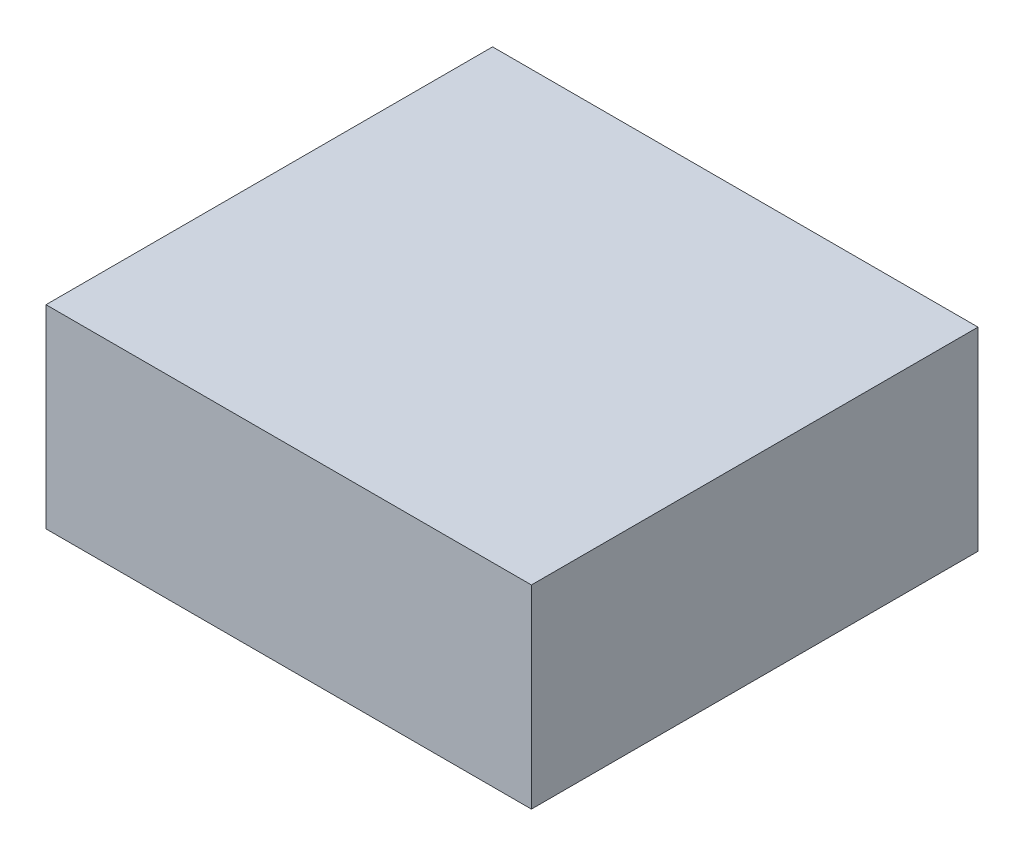
ISO-10303-21;
HEADER;
FILE_DESCRIPTION(('STEP AP214'),'2;1');
FILE_NAME('part.step','',(''),(''),'','','');
FILE_SCHEMA(('AUTOMOTIVE_DESIGN { 1 0 10303 214 1 1 1 1 }'));
ENDSEC;
DATA;
#1=APPLICATION_CONTEXT('core data for automotive mechanical design processes');
#2=APPLICATION_PROTOCOL_DEFINITION('international standard','automotive_design',2000,#1);
#3=PRODUCT_CONTEXT('',#1,'mechanical');
#4=PRODUCT('Part','Part','',(#3));
#5=PRODUCT_RELATED_PRODUCT_CATEGORY('part','',(#4));
#6=PRODUCT_DEFINITION_FORMATION('','',#4);
#7=PRODUCT_DEFINITION_CONTEXT('part definition',#1,'design');
#8=PRODUCT_DEFINITION('design','',#6,#7);
#9=PRODUCT_DEFINITION_SHAPE('','',#8);
#10=(LENGTH_UNIT() NAMED_UNIT(*) SI_UNIT(.MILLI.,.METRE.));
#11=(NAMED_UNIT(*) PLANE_ANGLE_UNIT() SI_UNIT($,.RADIAN.));
#12=(NAMED_UNIT(*) SI_UNIT($,.STERADIAN.) SOLID_ANGLE_UNIT());
#13=UNCERTAINTY_MEASURE_WITH_UNIT(LENGTH_MEASURE(1.E-05),#10,'distance_accuracy_value','');
#14=(GEOMETRIC_REPRESENTATION_CONTEXT(3) GLOBAL_UNCERTAINTY_ASSIGNED_CONTEXT((#13)) GLOBAL_UNIT_ASSIGNED_CONTEXT((#10,
#11,#12)) REPRESENTATION_CONTEXT('',''));
#15=CARTESIAN_POINT('',(0.,0.,0.));
#16=DIRECTION('',(0.,0.,1.));
#17=DIRECTION('',(1.,0.,0.));
#18=AXIS2_PLACEMENT_3D('',#15,#16,#17);
#19=CARTESIAN_POINT('',(0.,1.,0.));
#20=DIRECTION('',(1.,0.,0.));
#21=DIRECTION('',(0.,0.,-1.));
#22=AXIS2_PLACEMENT_3D('',#19,#20,#21);
#23=PLANE('',#22);
#24=DIRECTION('',(0.,0.,1.));
#25=VECTOR('',#24,1.);
#26=CARTESIAN_POINT('',(0.,0.,0.));
#27=LINE('',#26,#25);
#28=CARTESIAN_POINT('',(0.,0.,0.));
#29=VERTEX_POINT('',#28);
#30=CARTESIAN_POINT('',(0.,0.,2.3));
#31=VERTEX_POINT('',#30);
#32=EDGE_CURVE('E113',#29,#31,#27,.T.);
#33=ORIENTED_EDGE('',*,*,#32,.T.);
#34=DIRECTION('',(0.,-1.,0.));
#35=VECTOR('',#34,1.);
#36=CARTESIAN_POINT('',(0.,1.,2.3));
#37=LINE('',#36,#35);
#38=CARTESIAN_POINT('',(0.,1.,2.3));
#39=VERTEX_POINT('',#38);
#40=EDGE_CURVE('E11',#39,#31,#37,.T.);
#41=ORIENTED_EDGE('',*,*,#40,.F.);
#42=DIRECTION('',(0.,0.,1.));
#43=VECTOR('',#42,1.);
#44=CARTESIAN_POINT('',(0.,1.,0.));
#45=LINE('',#44,#43);
#46=CARTESIAN_POINT('',(0.,1.,0.));
#47=VERTEX_POINT('',#46);
#48=EDGE_CURVE('E97',#47,#39,#45,.T.);
#49=ORIENTED_EDGE('',*,*,#48,.F.);
#50=DIRECTION('',(0.,-1.,0.));
#51=VECTOR('',#50,1.);
#52=CARTESIAN_POINT('',(0.,1.,0.));
#53=LINE('',#52,#51);
#54=EDGE_CURVE('E109',#47,#29,#53,.T.);
#55=ORIENTED_EDGE('',*,*,#54,.T.);
#56=EDGE_LOOP('',(#33,#41,#49,#55));
#57=FACE_BOUND('',#56,.T.);
#58=ADVANCED_FACE('F45',(#57),#23,.F.);
#59=CARTESIAN_POINT('',(0.,1.,2.3));
#60=DIRECTION('',(0.,0.,-1.));
#61=DIRECTION('',(-1.,0.,0.));
#62=AXIS2_PLACEMENT_3D('',#59,#60,#61);
#63=PLANE('',#62);
#64=DIRECTION('',(1.,0.,0.));
#65=VECTOR('',#64,1.);
#66=CARTESIAN_POINT('',(0.,0.,2.3));
#67=LINE('',#66,#65);
#68=CARTESIAN_POINT('',(2.5,0.,2.3));
#69=VERTEX_POINT('',#68);
#70=EDGE_CURVE('E102',#31,#69,#67,.T.);
#71=ORIENTED_EDGE('',*,*,#70,.T.);
#72=DIRECTION('',(0.,-1.,0.));
#73=VECTOR('',#72,1.);
#74=CARTESIAN_POINT('',(2.5,1.,2.3));
#75=LINE('',#74,#73);
#76=CARTESIAN_POINT('',(2.5,1.,2.3));
#77=VERTEX_POINT('',#76);
#78=EDGE_CURVE('E54',#77,#69,#75,.T.);
#79=ORIENTED_EDGE('',*,*,#78,.F.);
#80=DIRECTION('',(1.,0.,0.));
#81=VECTOR('',#80,1.);
#82=CARTESIAN_POINT('',(0.,1.,2.3));
#83=LINE('',#82,#81);
#84=EDGE_CURVE('E92',#39,#77,#83,.T.);
#85=ORIENTED_EDGE('',*,*,#84,.F.);
#86=ORIENTED_EDGE('',*,*,#40,.T.);
#87=EDGE_LOOP('',(#71,#79,#85,#86));
#88=FACE_BOUND('',#87,.T.);
#89=ADVANCED_FACE('F101',(#88),#63,.F.);
#90=CARTESIAN_POINT('',(2.5,1.,0.));
#91=DIRECTION('',(-1.,0.,0.));
#92=DIRECTION('',(0.,0.,1.));
#93=AXIS2_PLACEMENT_3D('',#90,#91,#92);
#94=PLANE('',#93);
#95=DIRECTION('',(0.,0.,-1.));
#96=VECTOR('',#95,1.);
#97=CARTESIAN_POINT('',(2.5,0.,0.));
#98=LINE('',#97,#96);
#99=CARTESIAN_POINT('',(2.5,0.,0.));
#100=VERTEX_POINT('',#99);
#101=EDGE_CURVE('E79',#69,#100,#98,.T.);
#102=ORIENTED_EDGE('',*,*,#101,.T.);
#103=DIRECTION('',(0.,-1.,0.));
#104=VECTOR('',#103,1.);
#105=CARTESIAN_POINT('',(2.5,1.,0.));
#106=LINE('',#105,#104);
#107=CARTESIAN_POINT('',(2.5,1.,0.));
#108=VERTEX_POINT('',#107);
#109=EDGE_CURVE('E104',#108,#100,#106,.T.);
#110=ORIENTED_EDGE('',*,*,#109,.F.);
#111=DIRECTION('',(0.,0.,-1.));
#112=VECTOR('',#111,1.);
#113=CARTESIAN_POINT('',(2.5,1.,0.));
#114=LINE('',#113,#112);
#115=EDGE_CURVE('E95',#77,#108,#114,.T.);
#116=ORIENTED_EDGE('',*,*,#115,.F.);
#117=ORIENTED_EDGE('',*,*,#78,.T.);
#118=EDGE_LOOP('',(#102,#110,#116,#117));
#119=FACE_BOUND('',#118,.T.);
#120=ADVANCED_FACE('F105',(#119),#94,.F.);
#121=CARTESIAN_POINT('',(0.,1.,0.));
#122=DIRECTION('',(0.,0.,1.));
#123=DIRECTION('',(1.,0.,0.));
#124=AXIS2_PLACEMENT_3D('',#121,#122,#123);
#125=PLANE('',#124);
#126=DIRECTION('',(-1.,0.,0.));
#127=VECTOR('',#126,1.);
#128=CARTESIAN_POINT('',(0.,0.,0.));
#129=LINE('',#128,#127);
#130=EDGE_CURVE('E85',#100,#29,#129,.T.);
#131=ORIENTED_EDGE('',*,*,#130,.T.);
#132=ORIENTED_EDGE('',*,*,#54,.F.);
#133=DIRECTION('',(-1.,0.,0.));
#134=VECTOR('',#133,1.);
#135=CARTESIAN_POINT('',(0.,1.,0.));
#136=LINE('',#135,#134);
#137=EDGE_CURVE('E62',#108,#47,#136,.T.);
#138=ORIENTED_EDGE('',*,*,#137,.F.);
#139=ORIENTED_EDGE('',*,*,#109,.T.);
#140=EDGE_LOOP('',(#131,#132,#138,#139));
#141=FACE_BOUND('',#140,.T.);
#142=ADVANCED_FACE('F126',(#141),#125,.F.);
#143=CARTESIAN_POINT('',(0.,1.,0.));
#144=DIRECTION('',(0.,1.,0.));
#145=DIRECTION('',(0.,0.,1.));
#146=AXIS2_PLACEMENT_3D('',#143,#144,#145);
#147=PLANE('',#146);
#148=ORIENTED_EDGE('',*,*,#48,.T.);
#149=ORIENTED_EDGE('',*,*,#84,.T.);
#150=ORIENTED_EDGE('',*,*,#115,.T.);
#151=ORIENTED_EDGE('',*,*,#137,.T.);
#152=EDGE_LOOP('',(#148,#149,#150,#151));
#153=FACE_BOUND('',#152,.T.);
#154=ADVANCED_FACE('F93',(#153),#147,.T.);
#155=CARTESIAN_POINT('',(0.,0.,0.));
#156=DIRECTION('',(0.,1.,0.));
#157=DIRECTION('',(0.,0.,1.));
#158=AXIS2_PLACEMENT_3D('',#155,#156,#157);
#159=PLANE('',#158);
#160=ORIENTED_EDGE('',*,*,#32,.F.);
#161=ORIENTED_EDGE('',*,*,#130,.F.);
#162=ORIENTED_EDGE('',*,*,#101,.F.);
#163=ORIENTED_EDGE('',*,*,#70,.F.);
#164=EDGE_LOOP('',(#160,#161,#162,#163));
#165=FACE_BOUND('',#164,.T.);
#166=ADVANCED_FACE('F129',(#165),#159,.F.);
#167=CLOSED_SHELL('',(#58,#89,#120,#142,#154,#166));
#168=MANIFOLD_SOLID_BREP('B2',#167);
#169=ADVANCED_BREP_SHAPE_REPRESENTATION('',(#18,#168),#14);
#170=SHAPE_DEFINITION_REPRESENTATION(#9,#169);
ENDSEC;
END-ISO-10303-21;
